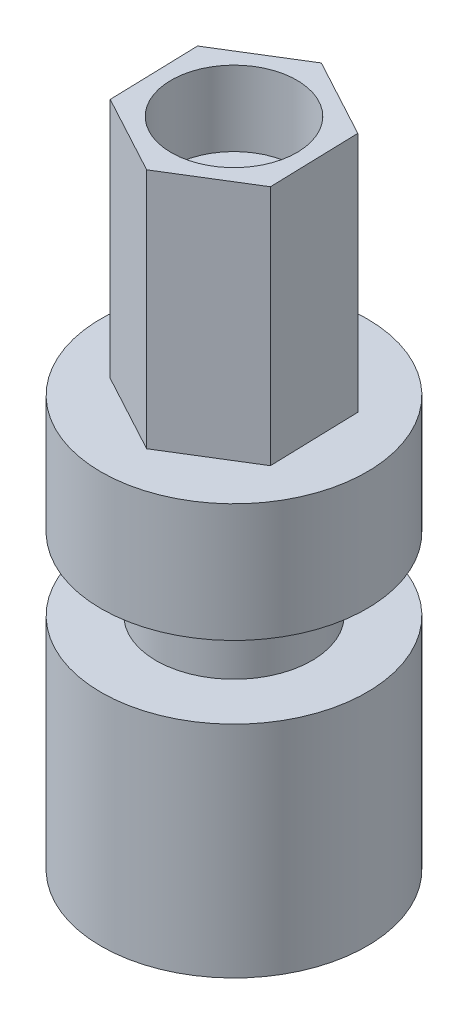
ISO-10303-21;
HEADER;
FILE_DESCRIPTION(('STEP AP214'),'2;1');
FILE_NAME('part.step','',(''),(''),'','','');
FILE_SCHEMA(('AUTOMOTIVE_DESIGN { 1 0 10303 214 1 1 1 1 }'));
ENDSEC;
DATA;
#1=APPLICATION_CONTEXT('core data for automotive mechanical design processes');
#2=APPLICATION_PROTOCOL_DEFINITION('international standard','automotive_design',2000,#1);
#3=PRODUCT_CONTEXT('',#1,'mechanical');
#4=PRODUCT('Part','Part','',(#3));
#5=PRODUCT_RELATED_PRODUCT_CATEGORY('part','',(#4));
#6=PRODUCT_DEFINITION_FORMATION('','',#4);
#7=PRODUCT_DEFINITION_CONTEXT('part definition',#1,'design');
#8=PRODUCT_DEFINITION('design','',#6,#7);
#9=PRODUCT_DEFINITION_SHAPE('','',#8);
#10=(LENGTH_UNIT() NAMED_UNIT(*) SI_UNIT(.MILLI.,.METRE.));
#11=(NAMED_UNIT(*) PLANE_ANGLE_UNIT() SI_UNIT($,.RADIAN.));
#12=(NAMED_UNIT(*) SI_UNIT($,.STERADIAN.) SOLID_ANGLE_UNIT());
#13=UNCERTAINTY_MEASURE_WITH_UNIT(LENGTH_MEASURE(1.E-05),#10,'distance_accuracy_value','');
#14=(GEOMETRIC_REPRESENTATION_CONTEXT(3) GLOBAL_UNCERTAINTY_ASSIGNED_CONTEXT((#13)) GLOBAL_UNIT_ASSIGNED_CONTEXT((#10,
#11,#12)) REPRESENTATION_CONTEXT('',''));
#15=CARTESIAN_POINT('',(0.,0.,0.));
#16=DIRECTION('',(0.,0.,1.));
#17=DIRECTION('',(1.,0.,0.));
#18=AXIS2_PLACEMENT_3D('',#15,#16,#17);
#19=CARTESIAN_POINT('',(0.,0.,0.));
#20=DIRECTION('',(0.,1.,0.));
#21=DIRECTION('',(0.,0.,1.));
#22=AXIS2_PLACEMENT_3D('',#19,#20,#21);
#23=CYLINDRICAL_SURFACE('',#22,1.5);
#24=CARTESIAN_POINT('',(0.,3.1,0.));
#25=DIRECTION('',(0.,-1.,0.));
#26=DIRECTION('',(0.,0.,-1.));
#27=AXIS2_PLACEMENT_3D('',#24,#25,#26);
#28=CIRCLE('',#27,1.5);
#29=CARTESIAN_POINT('',(0.,3.1,-1.5));
#30=VERTEX_POINT('',#29);
#31=EDGE_CURVE('E133',#30,#30,#28,.F.);
#32=ORIENTED_EDGE('',*,*,#31,.F.);
#33=EDGE_LOOP('',(#32));
#34=FACE_BOUND('',#33,.T.);
#35=CARTESIAN_POINT('',(0.,24.9,0.));
#36=DIRECTION('',(0.,1.,0.));
#37=DIRECTION('',(0.,0.,1.));
#38=AXIS2_PLACEMENT_3D('',#35,#36,#37);
#39=CIRCLE('',#38,1.5);
#40=CARTESIAN_POINT('',(0.,24.9,1.5));
#41=VERTEX_POINT('',#40);
#42=EDGE_CURVE('E49',#41,#41,#39,.F.);
#43=ORIENTED_EDGE('',*,*,#42,.F.);
#44=EDGE_LOOP('',(#43));
#45=FACE_BOUND('',#44,.T.);
#46=ADVANCED_FACE('F45',(#34,#45),#23,.F.);
#47=CARTESIAN_POINT('',(0.,9.,0.));
#48=DIRECTION('',(0.,-1.,0.));
#49=DIRECTION('',(0.,0.,-1.));
#50=AXIS2_PLACEMENT_3D('',#47,#48,#49);
#51=CYLINDRICAL_SURFACE('',#50,5.5);
#52=CARTESIAN_POINT('',(0.,1.,0.));
#53=DIRECTION('',(0.,1.,0.));
#54=DIRECTION('',(0.,0.,1.));
#55=AXIS2_PLACEMENT_3D('',#52,#53,#54);
#56=CIRCLE('',#55,5.5);
#57=CARTESIAN_POINT('',(0.,1.,5.5));
#58=VERTEX_POINT('',#57);
#59=EDGE_CURVE('E123',#58,#58,#56,.T.);
#60=ORIENTED_EDGE('',*,*,#59,.T.);
#61=EDGE_LOOP('',(#60));
#62=FACE_BOUND('',#61,.T.);
#63=CARTESIAN_POINT('',(0.,10.1,0.));
#64=DIRECTION('',(0.,1.,0.));
#65=DIRECTION('',(0.,0.,1.));
#66=AXIS2_PLACEMENT_3D('',#63,#64,#65);
#67=CIRCLE('',#66,5.5);
#68=CARTESIAN_POINT('',(0.,10.1,5.5));
#69=VERTEX_POINT('',#68);
#70=EDGE_CURVE('E137',#69,#69,#67,.T.);
#71=ORIENTED_EDGE('',*,*,#70,.F.);
#72=EDGE_LOOP('',(#71));
#73=FACE_BOUND('',#72,.T.);
#74=ADVANCED_FACE('F205',(#62,#73),#51,.T.);
#75=CARTESIAN_POINT('',(0.,1.,0.));
#76=DIRECTION('',(0.,-1.,0.));
#77=DIRECTION('',(0.,0.,-1.));
#78=AXIS2_PLACEMENT_3D('',#75,#76,#77);
#79=CYLINDRICAL_SURFACE('',#78,3.5);
#80=CARTESIAN_POINT('',(0.,1.,0.));
#81=DIRECTION('',(0.,1.,0.));
#82=DIRECTION('',(0.,0.,1.));
#83=AXIS2_PLACEMENT_3D('',#80,#81,#82);
#84=CIRCLE('',#83,3.5);
#85=CARTESIAN_POINT('',(0.,1.,3.5));
#86=VERTEX_POINT('',#85);
#87=EDGE_CURVE('E12',#86,#86,#84,.T.);
#88=ORIENTED_EDGE('',*,*,#87,.F.);
#89=EDGE_LOOP('',(#88));
#90=FACE_BOUND('',#89,.T.);
#91=CARTESIAN_POINT('',(0.,0.,0.));
#92=DIRECTION('',(0.,1.,0.));
#93=DIRECTION('',(0.,0.,1.));
#94=AXIS2_PLACEMENT_3D('',#91,#92,#93);
#95=CIRCLE('',#94,3.5);
#96=CARTESIAN_POINT('',(0.,0.,3.5));
#97=VERTEX_POINT('',#96);
#98=EDGE_CURVE('E54',#97,#97,#95,.T.);
#99=ORIENTED_EDGE('',*,*,#98,.T.);
#100=EDGE_LOOP('',(#99));
#101=FACE_BOUND('',#100,.T.);
#102=ADVANCED_FACE('F47',(#90,#101),#79,.T.);
#103=CARTESIAN_POINT('',(0.,0.,0.));
#104=DIRECTION('',(0.,1.,0.));
#105=DIRECTION('',(0.,0.,1.));
#106=AXIS2_PLACEMENT_3D('',#103,#104,#105);
#107=PLANE('',#106);
#108=CARTESIAN_POINT('',(0.,0.,0.));
#109=DIRECTION('',(0.,-1.,0.));
#110=DIRECTION('',(0.,0.,-1.));
#111=AXIS2_PLACEMENT_3D('',#108,#109,#110);
#112=CIRCLE('',#111,2.6);
#113=CARTESIAN_POINT('',(0.,0.,-2.6));
#114=VERTEX_POINT('',#113);
#115=EDGE_CURVE('E142',#114,#114,#112,.T.);
#116=ORIENTED_EDGE('',*,*,#115,.F.);
#117=EDGE_LOOP('',(#116));
#118=FACE_BOUND('',#117,.T.);
#119=ORIENTED_EDGE('',*,*,#98,.F.);
#120=EDGE_LOOP('',(#119));
#121=FACE_BOUND('',#120,.T.);
#122=ADVANCED_FACE('F318',(#118,#121),#107,.F.);
#123=CARTESIAN_POINT('',(0.,13.1,0.));
#124=DIRECTION('',(0.,1.,0.));
#125=DIRECTION('',(0.,0.,1.));
#126=AXIS2_PLACEMENT_3D('',#123,#124,#125);
#127=CIRCLE('',#126,5.5);
#128=CARTESIAN_POINT('',(0.,13.1,5.5));
#129=VERTEX_POINT('',#128);
#130=EDGE_CURVE('E139',#129,#129,#127,.T.);
#131=ORIENTED_EDGE('',*,*,#130,.T.);
#132=EDGE_LOOP('',(#131));
#133=FACE_BOUND('',#132,.T.);
#134=CARTESIAN_POINT('',(0.,18.,0.));
#135=DIRECTION('',(0.,1.,0.));
#136=DIRECTION('',(0.,0.,1.));
#137=AXIS2_PLACEMENT_3D('',#134,#135,#136);
#138=CIRCLE('',#137,5.5);
#139=CARTESIAN_POINT('',(0.,18.,5.5));
#140=VERTEX_POINT('',#139);
#141=EDGE_CURVE('E120',#140,#140,#138,.T.);
#142=ORIENTED_EDGE('',*,*,#141,.F.);
#143=EDGE_LOOP('',(#142));
#144=FACE_BOUND('',#143,.T.);
#145=ADVANCED_FACE('F213',(#133,#144),#51,.T.);
#146=CARTESIAN_POINT('',(0.,1.,0.));
#147=DIRECTION('',(0.,1.,0.));
#148=DIRECTION('',(0.,0.,1.));
#149=AXIS2_PLACEMENT_3D('',#146,#147,#148);
#150=PLANE('',#149);
#151=ORIENTED_EDGE('',*,*,#87,.T.);
#152=EDGE_LOOP('',(#151));
#153=FACE_BOUND('',#152,.T.);
#154=ORIENTED_EDGE('',*,*,#59,.F.);
#155=EDGE_LOOP('',(#154));
#156=FACE_BOUND('',#155,.T.);
#157=ADVANCED_FACE('F317',(#153,#156),#150,.F.);
#158=CARTESIAN_POINT('',(0.,18.,0.));
#159=DIRECTION('',(0.,1.,0.));
#160=DIRECTION('',(0.,0.,1.));
#161=AXIS2_PLACEMENT_3D('',#158,#159,#160);
#162=PLANE('',#161);
#163=DIRECTION('',(0.851282853542691,0.,-0.524707064240814));
#164=VECTOR('',#163,1.);
#165=CARTESIAN_POINT('',(0.107130241682354,18.,3.72236794410723));
#166=LINE('',#165,#164);
#167=CARTESIAN_POINT('',(0.107130241682354,18.,3.72236794410723));
#168=VERTEX_POINT('',#167);
#169=CARTESIAN_POINT('',(3.27723032267089,18.,1.76840646124313));
#170=VERTEX_POINT('',#169);
#171=EDGE_CURVE('E62',#168,#170,#166,.T.);
#172=ORIENTED_EDGE('',*,*,#171,.F.);
#173=DIRECTION('',(0.880051073949044,0.,0.474879044853671));
#174=VECTOR('',#173,1.);
#175=CARTESIAN_POINT('',(-3.17010008098854,18.,1.9539614828641));
#176=LINE('',#175,#174);
#177=CARTESIAN_POINT('',(-3.17010008098854,18.,1.9539614828641));
#178=VERTEX_POINT('',#177);
#179=EDGE_CURVE('E66',#178,#168,#176,.T.);
#180=ORIENTED_EDGE('',*,*,#179,.F.);
#181=DIRECTION('',(0.0287682204063526,0.,0.999586109094485));
#182=VECTOR('',#181,1.);
#183=CARTESIAN_POINT('',(-3.27723032267089,18.,-1.76840646124313));
#184=LINE('',#183,#182);
#185=CARTESIAN_POINT('',(-3.27723032267089,18.,-1.76840646124313));
#186=VERTEX_POINT('',#185);
#187=EDGE_CURVE('E169',#186,#178,#184,.T.);
#188=ORIENTED_EDGE('',*,*,#187,.F.);
#189=DIRECTION('',(-0.851282853542691,0.,0.524707064240814));
#190=VECTOR('',#189,1.);
#191=CARTESIAN_POINT('',(-0.107130241682356,18.,-3.72236794410723));
#192=LINE('',#191,#190);
#193=CARTESIAN_POINT('',(-0.107130241682356,18.,-3.72236794410723));
#194=VERTEX_POINT('',#193);
#195=EDGE_CURVE('E166',#194,#186,#192,.T.);
#196=ORIENTED_EDGE('',*,*,#195,.F.);
#197=DIRECTION('',(-0.880051073949044,0.,-0.474879044853671));
#198=VECTOR('',#197,1.);
#199=CARTESIAN_POINT('',(3.17010008098853,18.,-1.9539614828641));
#200=LINE('',#199,#198);
#201=CARTESIAN_POINT('',(3.17010008098853,18.,-1.9539614828641));
#202=VERTEX_POINT('',#201);
#203=EDGE_CURVE('E163',#202,#194,#200,.T.);
#204=ORIENTED_EDGE('',*,*,#203,.F.);
#205=DIRECTION('',(-0.0287682204063527,0.,-0.999586109094485));
#206=VECTOR('',#205,1.);
#207=CARTESIAN_POINT('',(3.27723032267089,18.,1.76840646124313));
#208=LINE('',#207,#206);
#209=EDGE_CURVE('E161',#170,#202,#208,.T.);
#210=ORIENTED_EDGE('',*,*,#209,.F.);
#211=EDGE_LOOP('',(#172,#180,#188,#196,#204,#210));
#212=FACE_BOUND('',#211,.T.);
#213=ORIENTED_EDGE('',*,*,#141,.T.);
#214=EDGE_LOOP('',(#213));
#215=FACE_BOUND('',#214,.T.);
#216=ADVANCED_FACE('F186',(#212,#215),#162,.T.);
#217=CARTESIAN_POINT('',(0.107130241682354,28.,3.72236794410723));
#218=DIRECTION('',(-0.524707064240814,0.,-0.851282853542691));
#219=DIRECTION('',(-0.851282853542691,0.,0.524707064240814));
#220=AXIS2_PLACEMENT_3D('',#217,#218,#219);
#221=PLANE('',#220);
#222=ORIENTED_EDGE('',*,*,#171,.T.);
#223=DIRECTION('',(0.,-1.,0.));
#224=VECTOR('',#223,1.);
#225=CARTESIAN_POINT('',(3.27723032267089,28.,1.76840646124313));
#226=LINE('',#225,#224);
#227=CARTESIAN_POINT('',(3.27723032267089,28.,1.76840646124313));
#228=VERTEX_POINT('',#227);
#229=EDGE_CURVE('E103',#228,#170,#226,.T.);
#230=ORIENTED_EDGE('',*,*,#229,.F.);
#231=DIRECTION('',(0.851282853542691,0.,-0.524707064240814));
#232=VECTOR('',#231,1.);
#233=CARTESIAN_POINT('',(0.107130241682354,28.,3.72236794410723));
#234=LINE('',#233,#232);
#235=CARTESIAN_POINT('',(0.107130241682354,28.,3.72236794410723));
#236=VERTEX_POINT('',#235);
#237=EDGE_CURVE('E109',#236,#228,#234,.T.);
#238=ORIENTED_EDGE('',*,*,#237,.F.);
#239=DIRECTION('',(0.,-1.,0.));
#240=VECTOR('',#239,1.);
#241=CARTESIAN_POINT('',(0.107130241682354,28.,3.72236794410723));
#242=LINE('',#241,#240);
#243=EDGE_CURVE('E159',#236,#168,#242,.T.);
#244=ORIENTED_EDGE('',*,*,#243,.T.);
#245=EDGE_LOOP('',(#222,#230,#238,#244));
#246=FACE_BOUND('',#245,.T.);
#247=ADVANCED_FACE('F119',(#246),#221,.F.);
#248=CARTESIAN_POINT('',(3.27723032267089,28.,1.76840646124313));
#249=DIRECTION('',(-0.999586109094485,0.,0.0287682204063527));
#250=DIRECTION('',(0.0287682204063527,0.,0.999586109094485));
#251=AXIS2_PLACEMENT_3D('',#248,#249,#250);
#252=PLANE('',#251);
#253=ORIENTED_EDGE('',*,*,#209,.T.);
#254=DIRECTION('',(0.,-1.,0.));
#255=VECTOR('',#254,1.);
#256=CARTESIAN_POINT('',(3.17010008098853,28.,-1.9539614828641));
#257=LINE('',#256,#255);
#258=CARTESIAN_POINT('',(3.17010008098853,28.,-1.9539614828641));
#259=VERTEX_POINT('',#258);
#260=EDGE_CURVE('E105',#259,#202,#257,.T.);
#261=ORIENTED_EDGE('',*,*,#260,.F.);
#262=DIRECTION('',(-0.0287682204063527,0.,-0.999586109094485));
#263=VECTOR('',#262,1.);
#264=CARTESIAN_POINT('',(3.27723032267089,28.,1.76840646124313));
#265=LINE('',#264,#263);
#266=EDGE_CURVE('E98',#228,#259,#265,.T.);
#267=ORIENTED_EDGE('',*,*,#266,.F.);
#268=ORIENTED_EDGE('',*,*,#229,.T.);
#269=EDGE_LOOP('',(#253,#261,#267,#268));
#270=FACE_BOUND('',#269,.T.);
#271=ADVANCED_FACE('F101',(#270),#252,.F.);
#272=CARTESIAN_POINT('',(3.17010008098853,28.,-1.9539614828641));
#273=DIRECTION('',(-0.474879044853671,0.,0.880051073949044));
#274=DIRECTION('',(0.880051073949044,0.,0.474879044853671));
#275=AXIS2_PLACEMENT_3D('',#272,#273,#274);
#276=PLANE('',#275);
#277=ORIENTED_EDGE('',*,*,#203,.T.);
#278=DIRECTION('',(0.,-1.,0.));
#279=VECTOR('',#278,1.);
#280=CARTESIAN_POINT('',(-0.107130241682356,28.,-3.72236794410723));
#281=LINE('',#280,#279);
#282=CARTESIAN_POINT('',(-0.107130241682356,28.,-3.72236794410723));
#283=VERTEX_POINT('',#282);
#284=EDGE_CURVE('E125',#283,#194,#281,.T.);
#285=ORIENTED_EDGE('',*,*,#284,.F.);
#286=DIRECTION('',(-0.880051073949044,0.,-0.474879044853671));
#287=VECTOR('',#286,1.);
#288=CARTESIAN_POINT('',(3.17010008098853,28.,-1.9539614828641));
#289=LINE('',#288,#287);
#290=EDGE_CURVE('E108',#259,#283,#289,.T.);
#291=ORIENTED_EDGE('',*,*,#290,.F.);
#292=ORIENTED_EDGE('',*,*,#260,.T.);
#293=EDGE_LOOP('',(#277,#285,#291,#292));
#294=FACE_BOUND('',#293,.T.);
#295=ADVANCED_FACE('F185',(#294),#276,.F.);
#296=CARTESIAN_POINT('',(-0.107130241682356,28.,-3.72236794410723));
#297=DIRECTION('',(0.524707064240814,0.,0.851282853542691));
#298=DIRECTION('',(0.851282853542691,0.,-0.524707064240814));
#299=AXIS2_PLACEMENT_3D('',#296,#297,#298);
#300=PLANE('',#299);
#301=ORIENTED_EDGE('',*,*,#195,.T.);
#302=DIRECTION('',(0.,-1.,0.));
#303=VECTOR('',#302,1.);
#304=CARTESIAN_POINT('',(-3.27723032267089,28.,-1.76840646124313));
#305=LINE('',#304,#303);
#306=CARTESIAN_POINT('',(-3.27723032267089,28.,-1.76840646124313));
#307=VERTEX_POINT('',#306);
#308=EDGE_CURVE('E176',#307,#186,#305,.T.);
#309=ORIENTED_EDGE('',*,*,#308,.F.);
#310=DIRECTION('',(-0.851282853542691,0.,0.524707064240814));
#311=VECTOR('',#310,1.);
#312=CARTESIAN_POINT('',(-0.107130241682356,28.,-3.72236794410723));
#313=LINE('',#312,#311);
#314=EDGE_CURVE('E154',#283,#307,#313,.T.);
#315=ORIENTED_EDGE('',*,*,#314,.F.);
#316=ORIENTED_EDGE('',*,*,#284,.T.);
#317=EDGE_LOOP('',(#301,#309,#315,#316));
#318=FACE_BOUND('',#317,.T.);
#319=ADVANCED_FACE('F182',(#318),#300,.F.);
#320=CARTESIAN_POINT('',(-3.27723032267089,28.,-1.76840646124313));
#321=DIRECTION('',(0.999586109094485,0.,-0.0287682204063526));
#322=DIRECTION('',(-0.0287682204063526,0.,-0.999586109094485));
#323=AXIS2_PLACEMENT_3D('',#320,#321,#322);
#324=PLANE('',#323);
#325=ORIENTED_EDGE('',*,*,#187,.T.);
#326=DIRECTION('',(0.,-1.,0.));
#327=VECTOR('',#326,1.);
#328=CARTESIAN_POINT('',(-3.17010008098854,28.,1.9539614828641));
#329=LINE('',#328,#327);
#330=CARTESIAN_POINT('',(-3.17010008098854,28.,1.9539614828641));
#331=VERTEX_POINT('',#330);
#332=EDGE_CURVE('E173',#331,#178,#329,.T.);
#333=ORIENTED_EDGE('',*,*,#332,.F.);
#334=DIRECTION('',(0.0287682204063526,0.,0.999586109094485));
#335=VECTOR('',#334,1.);
#336=CARTESIAN_POINT('',(-3.27723032267089,28.,-1.76840646124313));
#337=LINE('',#336,#335);
#338=EDGE_CURVE('E156',#307,#331,#337,.T.);
#339=ORIENTED_EDGE('',*,*,#338,.F.);
#340=ORIENTED_EDGE('',*,*,#308,.T.);
#341=EDGE_LOOP('',(#325,#333,#339,#340));
#342=FACE_BOUND('',#341,.T.);
#343=ADVANCED_FACE('F190',(#342),#324,.F.);
#344=CARTESIAN_POINT('',(-3.17010008098854,28.,1.9539614828641));
#345=DIRECTION('',(0.474879044853671,0.,-0.880051073949044));
#346=DIRECTION('',(-0.880051073949044,0.,-0.474879044853671));
#347=AXIS2_PLACEMENT_3D('',#344,#345,#346);
#348=PLANE('',#347);
#349=ORIENTED_EDGE('',*,*,#179,.T.);
#350=ORIENTED_EDGE('',*,*,#243,.F.);
#351=DIRECTION('',(0.880051073949044,0.,0.474879044853671));
#352=VECTOR('',#351,1.);
#353=CARTESIAN_POINT('',(-3.17010008098854,28.,1.9539614828641));
#354=LINE('',#353,#352);
#355=EDGE_CURVE('E114',#331,#236,#354,.T.);
#356=ORIENTED_EDGE('',*,*,#355,.F.);
#357=ORIENTED_EDGE('',*,*,#332,.T.);
#358=EDGE_LOOP('',(#349,#350,#356,#357));
#359=FACE_BOUND('',#358,.T.);
#360=ADVANCED_FACE('F193',(#359),#348,.F.);
#361=CARTESIAN_POINT('',(0.,28.,0.));
#362=DIRECTION('',(0.,1.,0.));
#363=DIRECTION('',(0.,0.,1.));
#364=AXIS2_PLACEMENT_3D('',#361,#362,#363);
#365=PLANE('',#364);
#366=CARTESIAN_POINT('',(0.,28.,0.));
#367=DIRECTION('',(0.,1.,0.));
#368=DIRECTION('',(0.,0.,1.));
#369=AXIS2_PLACEMENT_3D('',#366,#367,#368);
#370=CIRCLE('',#369,2.6);
#371=CARTESIAN_POINT('',(0.,28.,2.6));
#372=VERTEX_POINT('',#371);
#373=EDGE_CURVE('E253',#372,#372,#370,.T.);
#374=ORIENTED_EDGE('',*,*,#373,.F.);
#375=EDGE_LOOP('',(#374));
#376=FACE_BOUND('',#375,.T.);
#377=ORIENTED_EDGE('',*,*,#237,.T.);
#378=ORIENTED_EDGE('',*,*,#266,.T.);
#379=ORIENTED_EDGE('',*,*,#290,.T.);
#380=ORIENTED_EDGE('',*,*,#314,.T.);
#381=ORIENTED_EDGE('',*,*,#338,.T.);
#382=ORIENTED_EDGE('',*,*,#355,.T.);
#383=EDGE_LOOP('',(#377,#378,#379,#380,#381,#382));
#384=FACE_BOUND('',#383,.T.);
#385=ADVANCED_FACE('F112',(#376,#384),#365,.T.);
#386=CARTESIAN_POINT('',(0.,3.1,0.));
#387=DIRECTION('',(0.,-1.,0.));
#388=DIRECTION('',(0.,0.,-1.));
#389=AXIS2_PLACEMENT_3D('',#386,#387,#388);
#390=PLANE('',#389);
#391=CARTESIAN_POINT('',(0.,3.1,0.));
#392=DIRECTION('',(0.,-1.,0.));
#393=DIRECTION('',(0.,0.,-1.));
#394=AXIS2_PLACEMENT_3D('',#391,#392,#393);
#395=CIRCLE('',#394,2.6);
#396=CARTESIAN_POINT('',(0.,3.1,-2.6));
#397=VERTEX_POINT('',#396);
#398=EDGE_CURVE('E136',#397,#397,#395,.T.);
#399=ORIENTED_EDGE('',*,*,#398,.T.);
#400=EDGE_LOOP('',(#399));
#401=FACE_BOUND('',#400,.T.);
#402=ORIENTED_EDGE('',*,*,#31,.T.);
#403=EDGE_LOOP('',(#402));
#404=FACE_BOUND('',#403,.T.);
#405=ADVANCED_FACE('F200',(#401,#404),#390,.T.);
#406=CARTESIAN_POINT('',(0.,3.1,0.));
#407=DIRECTION('',(0.,-1.,0.));
#408=DIRECTION('',(0.,0.,-1.));
#409=AXIS2_PLACEMENT_3D('',#406,#407,#408);
#410=CYLINDRICAL_SURFACE('',#409,2.6);
#411=CARTESIAN_POINT('',(0.,3.1,-2.6));
#412=CARTESIAN_POINT('',(0.,3.06770833333333,-2.6));
#413=CARTESIAN_POINT('',(0.,3.03541666666667,-2.6));
#414=CARTESIAN_POINT('',(0.,2.97083333333333,-2.6));
#415=CARTESIAN_POINT('',(0.,2.93854166666667,-2.6));
#416=CARTESIAN_POINT('',(0.,2.87395833333333,-2.6));
#417=CARTESIAN_POINT('',(0.,2.84166666666667,-2.6));
#418=CARTESIAN_POINT('',(0.,2.77708333333333,-2.6));
#419=CARTESIAN_POINT('',(0.,2.74479166666667,-2.6));
#420=CARTESIAN_POINT('',(0.,2.68020833333333,-2.6));
#421=CARTESIAN_POINT('',(0.,2.64791666666667,-2.6));
#422=CARTESIAN_POINT('',(0.,2.58333333333333,-2.6));
#423=CARTESIAN_POINT('',(0.,2.55104166666667,-2.6));
#424=CARTESIAN_POINT('',(0.,2.48645833333333,-2.6));
#425=CARTESIAN_POINT('',(0.,2.45416666666667,-2.6));
#426=CARTESIAN_POINT('',(0.,2.38958333333333,-2.6));
#427=CARTESIAN_POINT('',(0.,2.35729166666667,-2.6));
#428=CARTESIAN_POINT('',(0.,2.29270833333333,-2.6));
#429=CARTESIAN_POINT('',(0.,2.26041666666667,-2.6));
#430=CARTESIAN_POINT('',(0.,2.19583333333333,-2.6));
#431=CARTESIAN_POINT('',(0.,2.16354166666667,-2.6));
#432=CARTESIAN_POINT('',(0.,2.09895833333333,-2.6));
#433=CARTESIAN_POINT('',(0.,2.06666666666667,-2.6));
#434=CARTESIAN_POINT('',(0.,2.00208333333333,-2.6));
#435=CARTESIAN_POINT('',(0.,1.96979166666667,-2.6));
#436=CARTESIAN_POINT('',(0.,1.90520833333333,-2.6));
#437=CARTESIAN_POINT('',(0.,1.87291666666667,-2.6));
#438=CARTESIAN_POINT('',(0.,1.80833333333333,-2.6));
#439=CARTESIAN_POINT('',(0.,1.77604166666667,-2.6));
#440=CARTESIAN_POINT('',(0.,1.71145833333333,-2.6));
#441=CARTESIAN_POINT('',(0.,1.67916666666667,-2.6));
#442=CARTESIAN_POINT('',(0.,1.61458333333333,-2.6));
#443=CARTESIAN_POINT('',(0.,1.58229166666667,-2.6));
#444=CARTESIAN_POINT('',(0.,1.51770833333333,-2.6));
#445=CARTESIAN_POINT('',(0.,1.48541666666667,-2.6));
#446=CARTESIAN_POINT('',(0.,1.42083333333333,-2.6));
#447=CARTESIAN_POINT('',(0.,1.38854166666667,-2.6));
#448=CARTESIAN_POINT('',(0.,1.32395833333333,-2.6));
#449=CARTESIAN_POINT('',(0.,1.29166666666667,-2.6));
#450=CARTESIAN_POINT('',(0.,1.22708333333333,-2.6));
#451=CARTESIAN_POINT('',(0.,1.19479166666667,-2.6));
#452=CARTESIAN_POINT('',(0.,1.13020833333333,-2.6));
#453=CARTESIAN_POINT('',(0.,1.09791666666667,-2.6));
#454=CARTESIAN_POINT('',(0.,1.03333333333333,-2.6));
#455=CARTESIAN_POINT('',(0.,1.00104166666667,-2.6));
#456=CARTESIAN_POINT('',(0.,0.936458333333334,-2.6));
#457=CARTESIAN_POINT('',(0.,0.904166666666667,-2.6));
#458=CARTESIAN_POINT('',(0.,0.839583333333334,-2.6));
#459=CARTESIAN_POINT('',(0.,0.807291666666667,-2.6));
#460=CARTESIAN_POINT('',(0.,0.742708333333334,-2.6));
#461=CARTESIAN_POINT('',(0.,0.710416666666667,-2.6));
#462=CARTESIAN_POINT('',(0.,0.645833333333334,-2.6));
#463=CARTESIAN_POINT('',(0.,0.613541666666667,-2.6));
#464=CARTESIAN_POINT('',(0.,0.548958333333333,-2.6));
#465=CARTESIAN_POINT('',(0.,0.516666666666667,-2.6));
#466=CARTESIAN_POINT('',(0.,0.452083333333333,-2.6));
#467=CARTESIAN_POINT('',(0.,0.419791666666667,-2.6));
#468=CARTESIAN_POINT('',(0.,0.355208333333334,-2.6));
#469=CARTESIAN_POINT('',(0.,0.322916666666667,-2.6));
#470=CARTESIAN_POINT('',(0.,0.258333333333333,-2.6));
#471=CARTESIAN_POINT('',(0.,0.226041666666667,-2.6));
#472=CARTESIAN_POINT('',(0.,0.161458333333333,-2.6));
#473=CARTESIAN_POINT('',(0.,0.129166666666667,-2.6));
#474=CARTESIAN_POINT('',(0.,0.0645833333333335,-2.6));
#475=CARTESIAN_POINT('',(0.,0.0322916666666667,-2.6));
#476=CARTESIAN_POINT('',(0.,0.,-2.6));
#477=B_SPLINE_CURVE_WITH_KNOTS('',3,(#411,#412,#413,#414,#415,#416,#417,#418,#419,#420,#421,
#422,#423,#424,#425,#426,#427,#428,#429,#430,#431,#432,#433,#434,#435,#436,#437,#438,#439,#440,
#441,#442,#443,#444,#445,#446,#447,#448,#449,#450,#451,#452,#453,#454,#455,#456,#457,#458,#459,
#460,#461,#462,#463,#464,#465,#466,#467,#468,#469,#470,#471,#472,#473,#474,#475,#476),
.UNSPECIFIED.,.F.,.F.,(4,2,2,2,2,2,2,2,2,2,2,2,2,2,2,2,2,2,2,2,2,2,2,2,2,2,2,2,2,2,2,2,4),(0.,
0.0968750000000002,0.19375,0.290625,0.3875,0.484375,0.58125,0.678125,0.775,0.871875,0.96875,
1.065625,1.1625,1.259375,1.35625,1.453125,1.55,1.646875,1.74375,1.840625,1.9375,2.034375,
2.13125,2.228125,2.325,2.421875,2.51875,2.615625,2.7125,2.809375,2.90625,3.003125,3.1),.UNSPECIFIED.);
#478=EDGE_CURVE('BSEAM217',#397,#114,#477,.T.);
#479=ORIENTED_EDGE('',*,*,#398,.F.);
#480=ORIENTED_EDGE('',*,*,#115,.T.);
#481=ORIENTED_EDGE('',*,*,#478,.T.);
#482=ORIENTED_EDGE('',*,*,#478,.F.);
#483=EDGE_LOOP('',(#479,#481,#480,#482));
#484=FACE_BOUND('',#483,.T.);
#485=ADVANCED_FACE('F217',(#484),#410,.F.);
#486=CARTESIAN_POINT('',(0.,13.1,0.));
#487=DIRECTION('',(0.,1.,0.));
#488=DIRECTION('',(0.,0.,1.));
#489=AXIS2_PLACEMENT_3D('',#486,#487,#488);
#490=PLANE('',#489);
#491=CARTESIAN_POINT('',(0.,13.1,0.));
#492=DIRECTION('',(0.,1.,0.));
#493=DIRECTION('',(0.,0.,1.));
#494=AXIS2_PLACEMENT_3D('',#491,#492,#493);
#495=CIRCLE('',#494,3.225);
#496=CARTESIAN_POINT('',(0.,13.1,3.225));
#497=VERTEX_POINT('',#496);
#498=EDGE_CURVE('E140',#497,#497,#495,.T.);
#499=ORIENTED_EDGE('',*,*,#498,.T.);
#500=EDGE_LOOP('',(#499));
#501=FACE_BOUND('',#500,.T.);
#502=ORIENTED_EDGE('',*,*,#130,.F.);
#503=EDGE_LOOP('',(#502));
#504=FACE_BOUND('',#503,.T.);
#505=ADVANCED_FACE('F220',(#501,#504),#490,.F.);
#506=CARTESIAN_POINT('',(0.,10.1,0.));
#507=DIRECTION('',(0.,1.,0.));
#508=DIRECTION('',(0.,0.,1.));
#509=AXIS2_PLACEMENT_3D('',#506,#507,#508);
#510=PLANE('',#509);
#511=CARTESIAN_POINT('',(0.,10.1,0.));
#512=DIRECTION('',(0.,1.,0.));
#513=DIRECTION('',(0.,0.,1.));
#514=AXIS2_PLACEMENT_3D('',#511,#512,#513);
#515=CIRCLE('',#514,3.225);
#516=CARTESIAN_POINT('',(0.,10.1,3.225));
#517=VERTEX_POINT('',#516);
#518=EDGE_CURVE('E251',#517,#517,#515,.T.);
#519=ORIENTED_EDGE('',*,*,#518,.F.);
#520=EDGE_LOOP('',(#519));
#521=FACE_BOUND('',#520,.T.);
#522=ORIENTED_EDGE('',*,*,#70,.T.);
#523=EDGE_LOOP('',(#522));
#524=FACE_BOUND('',#523,.T.);
#525=ADVANCED_FACE('F225',(#521,#524),#510,.T.);
#526=CARTESIAN_POINT('',(0.,13.1,0.));
#527=DIRECTION('',(0.,-1.,0.));
#528=DIRECTION('',(0.,0.,-1.));
#529=AXIS2_PLACEMENT_3D('',#526,#527,#528);
#530=CYLINDRICAL_SURFACE('',#529,3.225);
#531=ORIENTED_EDGE('',*,*,#498,.F.);
#532=EDGE_LOOP('',(#531));
#533=FACE_BOUND('',#532,.T.);
#534=ORIENTED_EDGE('',*,*,#518,.T.);
#535=EDGE_LOOP('',(#534));
#536=FACE_BOUND('',#535,.T.);
#537=ADVANCED_FACE('F228',(#533,#536),#530,.T.);
#538=CARTESIAN_POINT('',(0.,24.9,0.));
#539=DIRECTION('',(0.,1.,0.));
#540=DIRECTION('',(0.,0.,1.));
#541=AXIS2_PLACEMENT_3D('',#538,#539,#540);
#542=PLANE('',#541);
#543=CARTESIAN_POINT('',(0.,24.9,0.));
#544=DIRECTION('',(0.,1.,0.));
#545=DIRECTION('',(0.,0.,1.));
#546=AXIS2_PLACEMENT_3D('',#543,#544,#545);
#547=CIRCLE('',#546,2.6);
#548=CARTESIAN_POINT('',(0.,24.9,2.6));
#549=VERTEX_POINT('',#548);
#550=EDGE_CURVE('E248',#549,#549,#547,.T.);
#551=ORIENTED_EDGE('',*,*,#550,.T.);
#552=EDGE_LOOP('',(#551));
#553=FACE_BOUND('',#552,.T.);
#554=ORIENTED_EDGE('',*,*,#42,.T.);
#555=EDGE_LOOP('',(#554));
#556=FACE_BOUND('',#555,.T.);
#557=ADVANCED_FACE('F235',(#553,#556),#542,.T.);
#558=CARTESIAN_POINT('',(0.,24.9,0.));
#559=DIRECTION('',(0.,1.,0.));
#560=DIRECTION('',(0.,0.,1.));
#561=AXIS2_PLACEMENT_3D('',#558,#559,#560);
#562=CYLINDRICAL_SURFACE('',#561,2.6);
#563=CARTESIAN_POINT('',(0.,24.9,2.6));
#564=CARTESIAN_POINT('',(0.,24.9322916666667,2.6));
#565=CARTESIAN_POINT('',(0.,24.9645833333333,2.6));
#566=CARTESIAN_POINT('',(0.,25.0291666666667,2.6));
#567=CARTESIAN_POINT('',(0.,25.0614583333333,2.6));
#568=CARTESIAN_POINT('',(0.,25.1260416666667,2.6));
#569=CARTESIAN_POINT('',(0.,25.1583333333333,2.6));
#570=CARTESIAN_POINT('',(0.,25.2229166666667,2.6));
#571=CARTESIAN_POINT('',(0.,25.2552083333333,2.6));
#572=CARTESIAN_POINT('',(0.,25.3197916666667,2.6));
#573=CARTESIAN_POINT('',(0.,25.3520833333333,2.6));
#574=CARTESIAN_POINT('',(0.,25.4166666666667,2.6));
#575=CARTESIAN_POINT('',(0.,25.4489583333333,2.6));
#576=CARTESIAN_POINT('',(0.,25.5135416666667,2.6));
#577=CARTESIAN_POINT('',(0.,25.5458333333333,2.6));
#578=CARTESIAN_POINT('',(0.,25.6104166666667,2.6));
#579=CARTESIAN_POINT('',(0.,25.6427083333333,2.6));
#580=CARTESIAN_POINT('',(0.,25.7072916666667,2.6));
#581=CARTESIAN_POINT('',(0.,25.7395833333333,2.6));
#582=CARTESIAN_POINT('',(0.,25.8041666666667,2.6));
#583=CARTESIAN_POINT('',(0.,25.8364583333333,2.6));
#584=CARTESIAN_POINT('',(0.,25.9010416666667,2.6));
#585=CARTESIAN_POINT('',(0.,25.9333333333333,2.6));
#586=CARTESIAN_POINT('',(0.,25.9979166666667,2.6));
#587=CARTESIAN_POINT('',(0.,26.0302083333333,2.6));
#588=CARTESIAN_POINT('',(0.,26.0947916666667,2.6));
#589=CARTESIAN_POINT('',(0.,26.1270833333333,2.6));
#590=CARTESIAN_POINT('',(0.,26.1916666666667,2.6));
#591=CARTESIAN_POINT('',(0.,26.2239583333333,2.6));
#592=CARTESIAN_POINT('',(0.,26.2885416666667,2.6));
#593=CARTESIAN_POINT('',(0.,26.3208333333333,2.6));
#594=CARTESIAN_POINT('',(0.,26.3854166666667,2.6));
#595=CARTESIAN_POINT('',(0.,26.4177083333333,2.6));
#596=CARTESIAN_POINT('',(0.,26.4822916666667,2.6));
#597=CARTESIAN_POINT('',(0.,26.5145833333333,2.6));
#598=CARTESIAN_POINT('',(0.,26.5791666666667,2.6));
#599=CARTESIAN_POINT('',(0.,26.6114583333333,2.6));
#600=CARTESIAN_POINT('',(0.,26.6760416666667,2.6));
#601=CARTESIAN_POINT('',(0.,26.7083333333333,2.6));
#602=CARTESIAN_POINT('',(0.,26.7729166666667,2.6));
#603=CARTESIAN_POINT('',(0.,26.8052083333333,2.6));
#604=CARTESIAN_POINT('',(0.,26.8697916666667,2.6));
#605=CARTESIAN_POINT('',(0.,26.9020833333333,2.6));
#606=CARTESIAN_POINT('',(0.,26.9666666666667,2.6));
#607=CARTESIAN_POINT('',(0.,26.9989583333333,2.6));
#608=CARTESIAN_POINT('',(0.,27.0635416666667,2.6));
#609=CARTESIAN_POINT('',(0.,27.0958333333333,2.6));
#610=CARTESIAN_POINT('',(0.,27.1604166666667,2.6));
#611=CARTESIAN_POINT('',(0.,27.1927083333333,2.6));
#612=CARTESIAN_POINT('',(0.,27.2572916666667,2.6));
#613=CARTESIAN_POINT('',(0.,27.2895833333333,2.6));
#614=CARTESIAN_POINT('',(0.,27.3541666666667,2.6));
#615=CARTESIAN_POINT('',(0.,27.3864583333333,2.6));
#616=CARTESIAN_POINT('',(0.,27.4510416666667,2.6));
#617=CARTESIAN_POINT('',(0.,27.4833333333333,2.6));
#618=CARTESIAN_POINT('',(0.,27.5479166666667,2.6));
#619=CARTESIAN_POINT('',(0.,27.5802083333333,2.6));
#620=CARTESIAN_POINT('',(0.,27.6447916666667,2.6));
#621=CARTESIAN_POINT('',(0.,27.6770833333333,2.6));
#622=CARTESIAN_POINT('',(0.,27.7416666666667,2.6));
#623=CARTESIAN_POINT('',(0.,27.7739583333333,2.6));
#624=CARTESIAN_POINT('',(0.,27.8385416666667,2.6));
#625=CARTESIAN_POINT('',(0.,27.8708333333333,2.6));
#626=CARTESIAN_POINT('',(0.,27.9354166666667,2.6));
#627=CARTESIAN_POINT('',(0.,27.9677083333333,2.6));
#628=CARTESIAN_POINT('',(0.,28.,2.6));
#629=B_SPLINE_CURVE_WITH_KNOTS('',3,(#563,#564,#565,#566,#567,#568,#569,#570,#571,#572,#573,
#574,#575,#576,#577,#578,#579,#580,#581,#582,#583,#584,#585,#586,#587,#588,#589,#590,#591,#592,
#593,#594,#595,#596,#597,#598,#599,#600,#601,#602,#603,#604,#605,#606,#607,#608,#609,#610,#611,
#612,#613,#614,#615,#616,#617,#618,#619,#620,#621,#622,#623,#624,#625,#626,#627,#628),
.UNSPECIFIED.,.F.,.F.,(4,2,2,2,2,2,2,2,2,2,2,2,2,2,2,2,2,2,2,2,2,2,2,2,2,2,2,2,2,2,2,2,4),(0.,
0.0968749999999997,0.193749999999999,0.290624999999999,0.387499999999999,0.484374999999999,
0.581249999999998,0.678124999999998,0.774999999999998,0.871874999999998,0.968749999999997,
1.065625,1.1625,1.259375,1.35625,1.453125,1.55,1.646875,1.74375,1.840625,1.9375,2.034375,
2.13125,2.228125,2.325,2.421875,2.51875,2.615625,2.7125,2.809375,2.90625,3.003125,3.1),.UNSPECIFIED.);
#630=EDGE_CURVE('BSEAM237',#549,#372,#629,.T.);
#631=ORIENTED_EDGE('',*,*,#550,.F.);
#632=ORIENTED_EDGE('',*,*,#373,.T.);
#633=ORIENTED_EDGE('',*,*,#630,.T.);
#634=ORIENTED_EDGE('',*,*,#630,.F.);
#635=EDGE_LOOP('',(#631,#633,#632,#634));
#636=FACE_BOUND('',#635,.T.);
#637=ADVANCED_FACE('F237',(#636),#562,.F.);
#638=CLOSED_SHELL('',(#46,#74,#102,#122,#145,#157,#216,#247,#271,#295,#319,#343,#360,#385,#405,
#485,#505,#525,#537,#557,#637));
#639=MANIFOLD_SOLID_BREP('B2',#638);
#640=ADVANCED_BREP_SHAPE_REPRESENTATION('',(#18,#639),#14);
#641=SHAPE_DEFINITION_REPRESENTATION(#9,#640);
ENDSEC;
END-ISO-10303-21;
